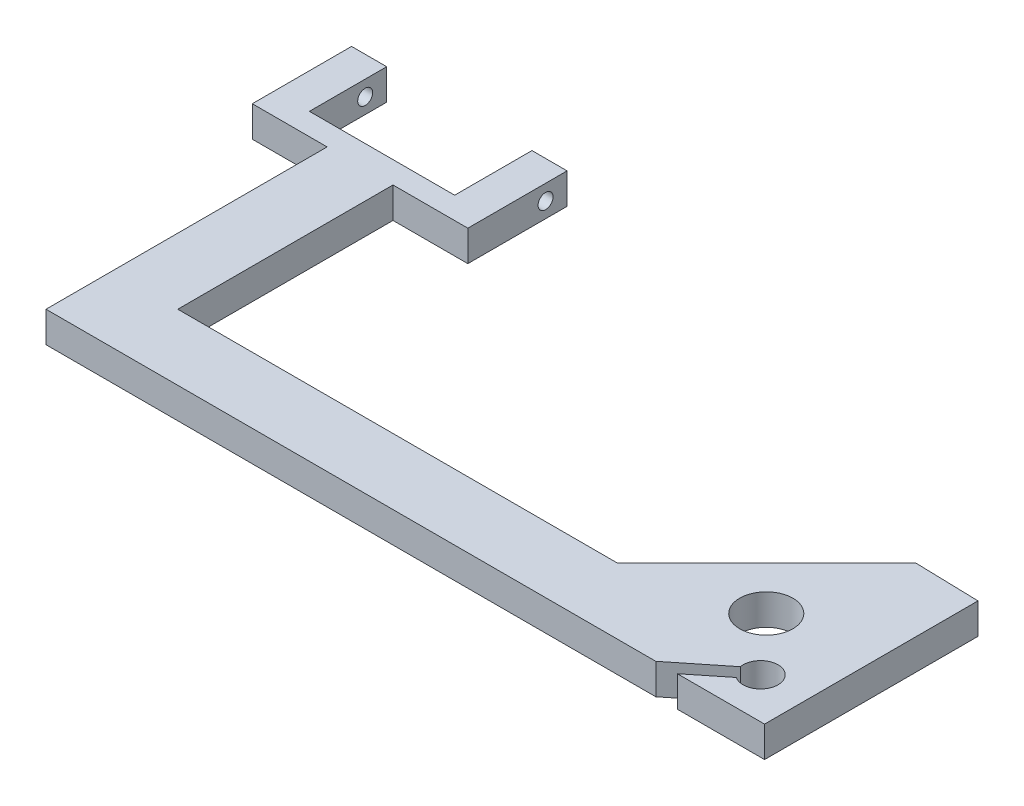
ISO-10303-21;
HEADER;
FILE_DESCRIPTION(('STEP AP214'),'2;1');
FILE_NAME('part.step','',(''),(''),'','','');
FILE_SCHEMA(('AUTOMOTIVE_DESIGN { 1 0 10303 214 1 1 1 1 }'));
ENDSEC;
DATA;
#1=APPLICATION_CONTEXT('core data for automotive mechanical design processes');
#2=APPLICATION_PROTOCOL_DEFINITION('international standard','automotive_design',2000,#1);
#3=PRODUCT_CONTEXT('',#1,'mechanical');
#4=PRODUCT('Part','Part','',(#3));
#5=PRODUCT_RELATED_PRODUCT_CATEGORY('part','',(#4));
#6=PRODUCT_DEFINITION_FORMATION('','',#4);
#7=PRODUCT_DEFINITION_CONTEXT('part definition',#1,'design');
#8=PRODUCT_DEFINITION('design','',#6,#7);
#9=PRODUCT_DEFINITION_SHAPE('','',#8);
#10=(LENGTH_UNIT() NAMED_UNIT(*) SI_UNIT(.MILLI.,.METRE.));
#11=(NAMED_UNIT(*) PLANE_ANGLE_UNIT() SI_UNIT($,.RADIAN.));
#12=(NAMED_UNIT(*) SI_UNIT($,.STERADIAN.) SOLID_ANGLE_UNIT());
#13=UNCERTAINTY_MEASURE_WITH_UNIT(LENGTH_MEASURE(1.E-05),#10,'distance_accuracy_value','');
#14=(GEOMETRIC_REPRESENTATION_CONTEXT(3) GLOBAL_UNCERTAINTY_ASSIGNED_CONTEXT((#13)) GLOBAL_UNIT_ASSIGNED_CONTEXT((#10,
#11,#12)) REPRESENTATION_CONTEXT('',''));
#15=CARTESIAN_POINT('',(0.,0.,0.));
#16=DIRECTION('',(0.,0.,1.));
#17=DIRECTION('',(1.,0.,0.));
#18=AXIS2_PLACEMENT_3D('',#15,#16,#17);
#19=CARTESIAN_POINT('',(76.0449505918015,7.,103.497483209416));
#20=DIRECTION('',(0.,1.,0.));
#21=DIRECTION('',(0.,0.,1.));
#22=AXIS2_PLACEMENT_3D('',#19,#20,#21);
#23=PLANE('',#22);
#24=DIRECTION('',(-1.,0.,0.));
#25=VECTOR('',#24,1.);
#26=CARTESIAN_POINT('',(-86.41,7.,26.1651780117579));
#27=LINE('',#26,#25);
#28=CARTESIAN_POINT('',(-86.41,7.,26.1651780117579));
#29=VERTEX_POINT('',#28);
#30=CARTESIAN_POINT('',(-94.41,7.,26.1651780117579));
#31=VERTEX_POINT('',#30);
#32=EDGE_CURVE('E247',#29,#31,#27,.T.);
#33=ORIENTED_EDGE('',*,*,#32,.T.);
#34=DIRECTION('',(0.,0.,1.));
#35=VECTOR('',#34,1.);
#36=CARTESIAN_POINT('',(-94.41,7.,26.1651780117579));
#37=LINE('',#36,#35);
#38=CARTESIAN_POINT('',(-94.41,7.,48.7651780117579));
#39=VERTEX_POINT('',#38);
#40=EDGE_CURVE('E134',#31,#39,#37,.T.);
#41=ORIENTED_EDGE('',*,*,#40,.T.);
#42=DIRECTION('',(1.,0.,0.));
#43=VECTOR('',#42,1.);
#44=CARTESIAN_POINT('',(-94.41,7.,48.7651780117579));
#45=LINE('',#44,#43);
#46=CARTESIAN_POINT('',(-77.375,7.,48.7651780117579));
#47=VERTEX_POINT('',#46);
#48=EDGE_CURVE('E299',#39,#47,#45,.T.);
#49=ORIENTED_EDGE('',*,*,#48,.T.);
#50=DIRECTION('',(0.,0.,1.));
#51=VECTOR('',#50,1.);
#52=CARTESIAN_POINT('',(-77.375,7.,48.7651780117579));
#53=LINE('',#52,#51);
#54=CARTESIAN_POINT('',(-77.375,7.,112.765178011758));
#55=VERTEX_POINT('',#54);
#56=EDGE_CURVE('E317',#47,#55,#53,.T.);
#57=ORIENTED_EDGE('',*,*,#56,.T.);
#58=DIRECTION('',(1.,0.,0.));
#59=VECTOR('',#58,1.);
#60=CARTESIAN_POINT('',(-77.375,7.,112.765178011758));
#61=LINE('',#60,#59);
#62=CARTESIAN_POINT('',(61.447619717696,7.,112.765178011758));
#63=VERTEX_POINT('',#62);
#64=EDGE_CURVE('E314',#55,#63,#61,.T.);
#65=ORIENTED_EDGE('',*,*,#64,.T.);
#66=DIRECTION('',(0.7806247497998,0.,-0.625));
#67=VECTOR('',#66,1.);
#68=CARTESIAN_POINT('',(72.140531110997,7.,104.203997210705));
#69=LINE('',#68,#67);
#70=CARTESIAN_POINT('',(72.140531110997,7.,104.203997210705));
#71=VERTEX_POINT('',#70);
#72=EDGE_CURVE('E316',#63,#71,#69,.T.);
#73=ORIENTED_EDGE('',*,*,#72,.T.);
#74=CARTESIAN_POINT('',(76.0449505918015,7.,103.497483209416));
#75=DIRECTION('',(0.,-1.,0.));
#76=DIRECTION('',(0.,0.,1.));
#77=AXIS2_PLACEMENT_3D('',#74,#75,#76);
#78=CIRCLE('',#77,3.96782730421856);
#79=CARTESIAN_POINT('',(73.8210632376066,7.,106.783510986529));
#80=VERTEX_POINT('',#79);
#81=EDGE_CURVE('E319',#71,#80,#78,.T.);
#82=ORIENTED_EDGE('',*,*,#81,.T.);
#83=DIRECTION('',(-0.780624749799801,0.,0.624999999999999));
#84=VECTOR('',#83,1.);
#85=CARTESIAN_POINT('',(66.3499635176781,7.,112.765178011758));
#86=LINE('',#85,#84);
#87=CARTESIAN_POINT('',(66.3499635176781,7.,112.765178011758));
#88=VERTEX_POINT('',#87);
#89=EDGE_CURVE('E325',#80,#88,#86,.T.);
#90=ORIENTED_EDGE('',*,*,#89,.T.);
#91=DIRECTION('',(1.,0.,0.));
#92=VECTOR('',#91,1.);
#93=CARTESIAN_POINT('',(66.3499635176781,7.,112.765178011758));
#94=LINE('',#93,#92);
#95=CARTESIAN_POINT('',(86.215,7.,112.765178011758));
#96=VERTEX_POINT('',#95);
#97=EDGE_CURVE('E327',#88,#96,#94,.T.);
#98=ORIENTED_EDGE('',*,*,#97,.T.);
#99=DIRECTION('',(0.,0.,-1.));
#100=VECTOR('',#99,1.);
#101=CARTESIAN_POINT('',(86.215,7.,112.765178011758));
#102=LINE('',#101,#100);
#103=CARTESIAN_POINT('',(86.215,7.,64.1751780117579));
#104=VERTEX_POINT('',#103);
#105=EDGE_CURVE('E329',#96,#104,#102,.T.);
#106=ORIENTED_EDGE('',*,*,#105,.T.);
#107=DIRECTION('',(-0.999653208963218,0.,-0.0263336630482963));
#108=VECTOR('',#107,1.);
#109=CARTESIAN_POINT('',(71.6000000000001,7.,63.7901780117579));
#110=LINE('',#109,#108);
#111=CARTESIAN_POINT('',(71.6000000000001,7.,63.7901780117579));
#112=VERTEX_POINT('',#111);
#113=EDGE_CURVE('E331',#104,#112,#110,.T.);
#114=ORIENTED_EDGE('',*,*,#113,.T.);
#115=DIRECTION('',(-0.707106781186548,0.,0.707106781186547));
#116=VECTOR('',#115,1.);
#117=CARTESIAN_POINT('',(71.6000000000001,7.,63.7901780117579));
#118=LINE('',#117,#116);
#119=CARTESIAN_POINT('',(37.625,7.,97.7651780117579));
#120=VERTEX_POINT('',#119);
#121=EDGE_CURVE('E333',#112,#120,#118,.T.);
#122=ORIENTED_EDGE('',*,*,#121,.T.);
#123=DIRECTION('',(-1.,0.,0.));
#124=VECTOR('',#123,1.);
#125=CARTESIAN_POINT('',(-62.375,7.,97.7651780117579));
#126=LINE('',#125,#124);
#127=CARTESIAN_POINT('',(-62.375,7.,97.7651780117579));
#128=VERTEX_POINT('',#127);
#129=EDGE_CURVE('E335',#120,#128,#126,.T.);
#130=ORIENTED_EDGE('',*,*,#129,.T.);
#131=DIRECTION('',(0.,0.,-1.));
#132=VECTOR('',#131,1.);
#133=CARTESIAN_POINT('',(-62.375,7.,48.7651780117579));
#134=LINE('',#133,#132);
#135=CARTESIAN_POINT('',(-62.375,7.,48.7651780117579));
#136=VERTEX_POINT('',#135);
#137=EDGE_CURVE('E337',#128,#136,#134,.T.);
#138=ORIENTED_EDGE('',*,*,#137,.T.);
#139=DIRECTION('',(1.,0.,0.));
#140=VECTOR('',#139,1.);
#141=CARTESIAN_POINT('',(-45.34,7.,48.7651780117579));
#142=LINE('',#141,#140);
#143=CARTESIAN_POINT('',(-45.34,7.,48.7651780117579));
#144=VERTEX_POINT('',#143);
#145=EDGE_CURVE('E339',#136,#144,#142,.T.);
#146=ORIENTED_EDGE('',*,*,#145,.T.);
#147=DIRECTION('',(0.,0.,-1.));
#148=VECTOR('',#147,1.);
#149=CARTESIAN_POINT('',(-45.34,7.,26.1651780117579));
#150=LINE('',#149,#148);
#151=CARTESIAN_POINT('',(-45.34,7.,26.1651780117579));
#152=VERTEX_POINT('',#151);
#153=EDGE_CURVE('E341',#144,#152,#150,.T.);
#154=ORIENTED_EDGE('',*,*,#153,.T.);
#155=DIRECTION('',(-1.,0.,0.));
#156=VECTOR('',#155,1.);
#157=CARTESIAN_POINT('',(-53.34,7.,26.1651780117579));
#158=LINE('',#157,#156);
#159=CARTESIAN_POINT('',(-53.34,7.,26.1651780117579));
#160=VERTEX_POINT('',#159);
#161=EDGE_CURVE('E189',#152,#160,#158,.T.);
#162=ORIENTED_EDGE('',*,*,#161,.T.);
#163=DIRECTION('',(0.,0.,1.));
#164=VECTOR('',#163,1.);
#165=CARTESIAN_POINT('',(-53.34,7.,43.7651780117579));
#166=LINE('',#165,#164);
#167=CARTESIAN_POINT('',(-53.34,7.,43.7651780117579));
#168=VERTEX_POINT('',#167);
#169=EDGE_CURVE('E183',#160,#168,#166,.T.);
#170=ORIENTED_EDGE('',*,*,#169,.T.);
#171=DIRECTION('',(-1.,0.,0.));
#172=VECTOR('',#171,1.);
#173=CARTESIAN_POINT('',(-86.41,7.,43.7651780117579));
#174=LINE('',#173,#172);
#175=CARTESIAN_POINT('',(-86.41,7.,43.7651780117579));
#176=VERTEX_POINT('',#175);
#177=EDGE_CURVE('E187',#168,#176,#174,.T.);
#178=ORIENTED_EDGE('',*,*,#177,.T.);
#179=DIRECTION('',(0.,0.,-1.));
#180=VECTOR('',#179,1.);
#181=CARTESIAN_POINT('',(-86.41,7.,26.1651780117579));
#182=LINE('',#181,#180);
#183=EDGE_CURVE('E55',#176,#29,#182,.T.);
#184=ORIENTED_EDGE('',*,*,#183,.T.);
#185=EDGE_LOOP('',(#33,#41,#49,#57,#65,#73,#82,#90,#98,#106,#114,#122,#130,#138,#146,#154,#162,
#170,#178,#184));
#186=FACE_BOUND('',#185,.T.);
#187=CARTESIAN_POINT('',(64.6000000000001,7.,90.7651780117579));
#188=DIRECTION('',(0.,1.,0.));
#189=DIRECTION('',(0.,0.,1.));
#190=AXIS2_PLACEMENT_3D('',#187,#188,#189);
#191=CIRCLE('',#190,6.05);
#192=CARTESIAN_POINT('',(64.6000000000001,7.,96.8151780117579));
#193=VERTEX_POINT('',#192);
#194=EDGE_CURVE('E211',#193,#193,#191,.T.);
#195=ORIENTED_EDGE('',*,*,#194,.F.);
#196=EDGE_LOOP('',(#195));
#197=FACE_BOUND('',#196,.T.);
#198=ADVANCED_FACE('F37',(#186,#197),#23,.T.);
#199=CARTESIAN_POINT('',(76.0449505918015,0.,103.497483209416));
#200=DIRECTION('',(0.,1.,0.));
#201=DIRECTION('',(0.,0.,1.));
#202=AXIS2_PLACEMENT_3D('',#199,#200,#201);
#203=PLANE('',#202);
#204=DIRECTION('',(-1.,0.,0.));
#205=VECTOR('',#204,1.);
#206=CARTESIAN_POINT('',(-86.41,0.,26.1651780117579));
#207=LINE('',#206,#205);
#208=CARTESIAN_POINT('',(-86.41,0.,26.1651780117579));
#209=VERTEX_POINT('',#208);
#210=CARTESIAN_POINT('',(-94.41,0.,26.1651780117579));
#211=VERTEX_POINT('',#210);
#212=EDGE_CURVE('E207',#209,#211,#207,.T.);
#213=ORIENTED_EDGE('',*,*,#212,.F.);
#214=DIRECTION('',(0.,0.,-1.));
#215=VECTOR('',#214,1.);
#216=CARTESIAN_POINT('',(-86.41,0.,26.1651780117579));
#217=LINE('',#216,#215);
#218=CARTESIAN_POINT('',(-86.41,0.,43.7651780117579));
#219=VERTEX_POINT('',#218);
#220=EDGE_CURVE('E126',#219,#209,#217,.T.);
#221=ORIENTED_EDGE('',*,*,#220,.F.);
#222=DIRECTION('',(-1.,0.,0.));
#223=VECTOR('',#222,1.);
#224=CARTESIAN_POINT('',(-86.41,0.,43.7651780117579));
#225=LINE('',#224,#223);
#226=CARTESIAN_POINT('',(-53.34,0.,43.7651780117579));
#227=VERTEX_POINT('',#226);
#228=EDGE_CURVE('E120',#227,#219,#225,.T.);
#229=ORIENTED_EDGE('',*,*,#228,.F.);
#230=DIRECTION('',(0.,0.,1.));
#231=VECTOR('',#230,1.);
#232=CARTESIAN_POINT('',(-53.34,0.,43.7651780117579));
#233=LINE('',#232,#231);
#234=CARTESIAN_POINT('',(-53.34,0.,26.1651780117579));
#235=VERTEX_POINT('',#234);
#236=EDGE_CURVE('E197',#235,#227,#233,.T.);
#237=ORIENTED_EDGE('',*,*,#236,.F.);
#238=DIRECTION('',(-1.,0.,0.));
#239=VECTOR('',#238,1.);
#240=CARTESIAN_POINT('',(-53.34,0.,26.1651780117579));
#241=LINE('',#240,#239);
#242=CARTESIAN_POINT('',(-45.34,0.,26.1651780117579));
#243=VERTEX_POINT('',#242);
#244=EDGE_CURVE('E242',#243,#235,#241,.T.);
#245=ORIENTED_EDGE('',*,*,#244,.F.);
#246=DIRECTION('',(0.,0.,-1.));
#247=VECTOR('',#246,1.);
#248=CARTESIAN_POINT('',(-45.34,0.,26.1651780117579));
#249=LINE('',#248,#247);
#250=CARTESIAN_POINT('',(-45.34,0.,48.7651780117579));
#251=VERTEX_POINT('',#250);
#252=EDGE_CURVE('E240',#251,#243,#249,.T.);
#253=ORIENTED_EDGE('',*,*,#252,.F.);
#254=DIRECTION('',(1.,0.,0.));
#255=VECTOR('',#254,1.);
#256=CARTESIAN_POINT('',(-45.34,0.,48.7651780117579));
#257=LINE('',#256,#255);
#258=CARTESIAN_POINT('',(-62.375,0.,48.7651780117579));
#259=VERTEX_POINT('',#258);
#260=EDGE_CURVE('E238',#259,#251,#257,.T.);
#261=ORIENTED_EDGE('',*,*,#260,.F.);
#262=DIRECTION('',(0.,0.,-1.));
#263=VECTOR('',#262,1.);
#264=CARTESIAN_POINT('',(-62.375,0.,48.7651780117579));
#265=LINE('',#264,#263);
#266=CARTESIAN_POINT('',(-62.375,0.,97.7651780117579));
#267=VERTEX_POINT('',#266);
#268=EDGE_CURVE('E236',#267,#259,#265,.T.);
#269=ORIENTED_EDGE('',*,*,#268,.F.);
#270=DIRECTION('',(-1.,0.,0.));
#271=VECTOR('',#270,1.);
#272=CARTESIAN_POINT('',(-62.375,0.,97.7651780117579));
#273=LINE('',#272,#271);
#274=CARTESIAN_POINT('',(37.625,0.,97.7651780117579));
#275=VERTEX_POINT('',#274);
#276=EDGE_CURVE('E234',#275,#267,#273,.T.);
#277=ORIENTED_EDGE('',*,*,#276,.F.);
#278=DIRECTION('',(-0.707106781186548,0.,0.707106781186547));
#279=VECTOR('',#278,1.);
#280=CARTESIAN_POINT('',(71.6000000000001,0.,63.7901780117579));
#281=LINE('',#280,#279);
#282=CARTESIAN_POINT('',(71.6000000000001,0.,63.7901780117579));
#283=VERTEX_POINT('',#282);
#284=EDGE_CURVE('E232',#283,#275,#281,.T.);
#285=ORIENTED_EDGE('',*,*,#284,.F.);
#286=DIRECTION('',(-0.999653208963218,0.,-0.0263336630482963));
#287=VECTOR('',#286,1.);
#288=CARTESIAN_POINT('',(71.6000000000001,0.,63.7901780117579));
#289=LINE('',#288,#287);
#290=CARTESIAN_POINT('',(86.215,0.,64.1751780117579));
#291=VERTEX_POINT('',#290);
#292=EDGE_CURVE('E230',#291,#283,#289,.T.);
#293=ORIENTED_EDGE('',*,*,#292,.F.);
#294=DIRECTION('',(0.,0.,-1.));
#295=VECTOR('',#294,1.);
#296=CARTESIAN_POINT('',(86.215,0.,112.765178011758));
#297=LINE('',#296,#295);
#298=CARTESIAN_POINT('',(86.215,0.,112.765178011758));
#299=VERTEX_POINT('',#298);
#300=EDGE_CURVE('E228',#299,#291,#297,.T.);
#301=ORIENTED_EDGE('',*,*,#300,.F.);
#302=DIRECTION('',(1.,0.,0.));
#303=VECTOR('',#302,1.);
#304=CARTESIAN_POINT('',(66.3499635176781,0.,112.765178011758));
#305=LINE('',#304,#303);
#306=CARTESIAN_POINT('',(66.3499635176781,0.,112.765178011758));
#307=VERTEX_POINT('',#306);
#308=EDGE_CURVE('E226',#307,#299,#305,.T.);
#309=ORIENTED_EDGE('',*,*,#308,.F.);
#310=DIRECTION('',(-0.780624749799801,0.,0.624999999999999));
#311=VECTOR('',#310,1.);
#312=CARTESIAN_POINT('',(66.3499635176781,0.,112.765178011758));
#313=LINE('',#312,#311);
#314=CARTESIAN_POINT('',(73.8210632376066,0.,106.783510986529));
#315=VERTEX_POINT('',#314);
#316=EDGE_CURVE('E224',#315,#307,#313,.T.);
#317=ORIENTED_EDGE('',*,*,#316,.F.);
#318=CARTESIAN_POINT('',(76.0449505918015,0.,103.497483209416));
#319=DIRECTION('',(0.,-1.,0.));
#320=DIRECTION('',(0.,0.,1.));
#321=AXIS2_PLACEMENT_3D('',#318,#319,#320);
#322=CIRCLE('',#321,3.96782730421856);
#323=CARTESIAN_POINT('',(72.140531110997,0.,104.203997210705));
#324=VERTEX_POINT('',#323);
#325=EDGE_CURVE('E222',#324,#315,#322,.T.);
#326=ORIENTED_EDGE('',*,*,#325,.F.);
#327=DIRECTION('',(0.7806247497998,0.,-0.625));
#328=VECTOR('',#327,1.);
#329=CARTESIAN_POINT('',(72.140531110997,0.,104.203997210705));
#330=LINE('',#329,#328);
#331=CARTESIAN_POINT('',(61.447619717696,0.,112.765178011758));
#332=VERTEX_POINT('',#331);
#333=EDGE_CURVE('E220',#332,#324,#330,.T.);
#334=ORIENTED_EDGE('',*,*,#333,.F.);
#335=DIRECTION('',(1.,0.,0.));
#336=VECTOR('',#335,1.);
#337=CARTESIAN_POINT('',(61.447619717696,0.,112.765178011758));
#338=LINE('',#337,#336);
#339=CARTESIAN_POINT('',(-77.375,0.,112.765178011758));
#340=VERTEX_POINT('',#339);
#341=EDGE_CURVE('E218',#340,#332,#338,.T.);
#342=ORIENTED_EDGE('',*,*,#341,.F.);
#343=DIRECTION('',(0.,0.,1.));
#344=VECTOR('',#343,1.);
#345=CARTESIAN_POINT('',(-77.375,0.,48.7651780117579));
#346=LINE('',#345,#344);
#347=CARTESIAN_POINT('',(-77.375,0.,48.7651780117579));
#348=VERTEX_POINT('',#347);
#349=EDGE_CURVE('E215',#348,#340,#346,.T.);
#350=ORIENTED_EDGE('',*,*,#349,.F.);
#351=DIRECTION('',(1.,0.,0.));
#352=VECTOR('',#351,1.);
#353=CARTESIAN_POINT('',(-94.41,0.,48.7651780117579));
#354=LINE('',#353,#352);
#355=CARTESIAN_POINT('',(-94.41,0.,48.7651780117579));
#356=VERTEX_POINT('',#355);
#357=EDGE_CURVE('E213',#356,#348,#354,.T.);
#358=ORIENTED_EDGE('',*,*,#357,.F.);
#359=DIRECTION('',(0.,0.,1.));
#360=VECTOR('',#359,1.);
#361=CARTESIAN_POINT('',(-94.41,0.,26.1651780117579));
#362=LINE('',#361,#360);
#363=EDGE_CURVE('E210',#211,#356,#362,.T.);
#364=ORIENTED_EDGE('',*,*,#363,.F.);
#365=EDGE_LOOP('',(#213,#221,#229,#237,#245,#253,#261,#269,#277,#285,#293,#301,#309,#317,#326,
#334,#342,#350,#358,#364));
#366=FACE_BOUND('',#365,.T.);
#367=CARTESIAN_POINT('',(64.6000000000001,0.,90.7651780117579));
#368=DIRECTION('',(0.,1.,0.));
#369=DIRECTION('',(0.,0.,1.));
#370=AXIS2_PLACEMENT_3D('',#367,#368,#369);
#371=CIRCLE('',#370,6.05);
#372=CARTESIAN_POINT('',(64.6000000000001,0.,96.8151780117579));
#373=VERTEX_POINT('',#372);
#374=EDGE_CURVE('E389',#373,#373,#371,.T.);
#375=ORIENTED_EDGE('',*,*,#374,.T.);
#376=EDGE_LOOP('',(#375));
#377=FACE_BOUND('',#376,.T.);
#378=ADVANCED_FACE('F303',(#366,#377),#203,.F.);
#379=CARTESIAN_POINT('',(-86.41,7.,26.1651780117579));
#380=DIRECTION('',(0.,0.,1.));
#381=DIRECTION('',(1.,0.,0.));
#382=AXIS2_PLACEMENT_3D('',#379,#380,#381);
#383=PLANE('',#382);
#384=ORIENTED_EDGE('',*,*,#212,.T.);
#385=DIRECTION('',(0.,-1.,0.));
#386=VECTOR('',#385,1.);
#387=CARTESIAN_POINT('',(-94.41,7.,26.1651780117579));
#388=LINE('',#387,#386);
#389=EDGE_CURVE('E11',#31,#211,#388,.T.);
#390=ORIENTED_EDGE('',*,*,#389,.F.);
#391=ORIENTED_EDGE('',*,*,#32,.F.);
#392=DIRECTION('',(0.,-1.,0.));
#393=VECTOR('',#392,1.);
#394=CARTESIAN_POINT('',(-86.41,7.,26.1651780117579));
#395=LINE('',#394,#393);
#396=EDGE_CURVE('E203',#29,#209,#395,.T.);
#397=ORIENTED_EDGE('',*,*,#396,.T.);
#398=EDGE_LOOP('',(#384,#390,#391,#397));
#399=FACE_BOUND('',#398,.T.);
#400=ADVANCED_FACE('F39',(#399),#383,.F.);
#401=CARTESIAN_POINT('',(-94.41,7.,26.1651780117579));
#402=DIRECTION('',(1.,0.,0.));
#403=DIRECTION('',(0.,0.,-1.));
#404=AXIS2_PLACEMENT_3D('',#401,#402,#403);
#405=PLANE('',#404);
#406=CARTESIAN_POINT('',(-94.41,3.5,31.0651780117579));
#407=DIRECTION('',(1.,0.,0.));
#408=DIRECTION('',(0.,0.,-1.));
#409=AXIS2_PLACEMENT_3D('',#406,#407,#408);
#410=CIRCLE('',#409,1.7);
#411=CARTESIAN_POINT('',(-94.41,3.5,29.3651780117579));
#412=VERTEX_POINT('',#411);
#413=EDGE_CURVE('E387',#412,#412,#410,.T.);
#414=ORIENTED_EDGE('',*,*,#413,.T.);
#415=EDGE_LOOP('',(#414));
#416=FACE_BOUND('',#415,.T.);
#417=ORIENTED_EDGE('',*,*,#363,.T.);
#418=DIRECTION('',(0.,-1.,0.));
#419=VECTOR('',#418,1.);
#420=CARTESIAN_POINT('',(-94.41,7.,48.7651780117579));
#421=LINE('',#420,#419);
#422=EDGE_CURVE('E47',#39,#356,#421,.T.);
#423=ORIENTED_EDGE('',*,*,#422,.F.);
#424=ORIENTED_EDGE('',*,*,#40,.F.);
#425=ORIENTED_EDGE('',*,*,#389,.T.);
#426=EDGE_LOOP('',(#417,#423,#424,#425));
#427=FACE_BOUND('',#426,.T.);
#428=ADVANCED_FACE('F462',(#416,#427),#405,.F.);
#429=CARTESIAN_POINT('',(-94.41,7.,48.7651780117579));
#430=DIRECTION('',(0.,0.,-1.));
#431=DIRECTION('',(-1.,0.,0.));
#432=AXIS2_PLACEMENT_3D('',#429,#430,#431);
#433=PLANE('',#432);
#434=ORIENTED_EDGE('',*,*,#357,.T.);
#435=DIRECTION('',(0.,-1.,0.));
#436=VECTOR('',#435,1.);
#437=CARTESIAN_POINT('',(-77.375,7.,48.7651780117579));
#438=LINE('',#437,#436);
#439=EDGE_CURVE('E290',#47,#348,#438,.T.);
#440=ORIENTED_EDGE('',*,*,#439,.F.);
#441=ORIENTED_EDGE('',*,*,#48,.F.);
#442=ORIENTED_EDGE('',*,*,#422,.T.);
#443=EDGE_LOOP('',(#434,#440,#441,#442));
#444=FACE_BOUND('',#443,.T.);
#445=ADVANCED_FACE('F297',(#444),#433,.F.);
#446=CARTESIAN_POINT('',(-77.375,7.,48.7651780117579));
#447=DIRECTION('',(1.,0.,0.));
#448=DIRECTION('',(0.,0.,-1.));
#449=AXIS2_PLACEMENT_3D('',#446,#447,#448);
#450=PLANE('',#449);
#451=ORIENTED_EDGE('',*,*,#349,.T.);
#452=DIRECTION('',(0.,-1.,0.));
#453=VECTOR('',#452,1.);
#454=CARTESIAN_POINT('',(-77.375,7.,112.765178011758));
#455=LINE('',#454,#453);
#456=EDGE_CURVE('E287',#55,#340,#455,.T.);
#457=ORIENTED_EDGE('',*,*,#456,.F.);
#458=ORIENTED_EDGE('',*,*,#56,.F.);
#459=ORIENTED_EDGE('',*,*,#439,.T.);
#460=EDGE_LOOP('',(#451,#457,#458,#459));
#461=FACE_BOUND('',#460,.T.);
#462=ADVANCED_FACE('F308',(#461),#450,.F.);
#463=CARTESIAN_POINT('',(61.447619717696,7.,112.765178011758));
#464=DIRECTION('',(0.,0.,-1.));
#465=DIRECTION('',(-1.,0.,0.));
#466=AXIS2_PLACEMENT_3D('',#463,#464,#465);
#467=PLANE('',#466);
#468=ORIENTED_EDGE('',*,*,#341,.T.);
#469=DIRECTION('',(0.,-1.,0.));
#470=VECTOR('',#469,1.);
#471=CARTESIAN_POINT('',(61.447619717696,7.,112.765178011758));
#472=LINE('',#471,#470);
#473=EDGE_CURVE('E284',#63,#332,#472,.T.);
#474=ORIENTED_EDGE('',*,*,#473,.F.);
#475=ORIENTED_EDGE('',*,*,#64,.F.);
#476=ORIENTED_EDGE('',*,*,#456,.T.);
#477=EDGE_LOOP('',(#468,#474,#475,#476));
#478=FACE_BOUND('',#477,.T.);
#479=ADVANCED_FACE('F312',(#478),#467,.F.);
#480=CARTESIAN_POINT('',(72.140531110997,7.,104.203997210705));
#481=DIRECTION('',(-0.625,0.,-0.7806247497998));
#482=DIRECTION('',(-0.7806247497998,0.,0.625));
#483=AXIS2_PLACEMENT_3D('',#480,#481,#482);
#484=PLANE('',#483);
#485=ORIENTED_EDGE('',*,*,#333,.T.);
#486=DIRECTION('',(0.,-1.,0.));
#487=VECTOR('',#486,1.);
#488=CARTESIAN_POINT('',(72.140531110997,7.,104.203997210705));
#489=LINE('',#488,#487);
#490=EDGE_CURVE('E281',#71,#324,#489,.T.);
#491=ORIENTED_EDGE('',*,*,#490,.F.);
#492=ORIENTED_EDGE('',*,*,#72,.F.);
#493=ORIENTED_EDGE('',*,*,#473,.T.);
#494=EDGE_LOOP('',(#485,#491,#492,#493));
#495=FACE_BOUND('',#494,.T.);
#496=ADVANCED_FACE('F452',(#495),#484,.F.);
#497=CARTESIAN_POINT('',(76.0449505918015,7.,103.497483209416));
#498=DIRECTION('',(0.,-1.,0.));
#499=DIRECTION('',(0.,0.,-1.));
#500=AXIS2_PLACEMENT_3D('',#497,#498,#499);
#501=CYLINDRICAL_SURFACE('',#500,3.96782730421856);
#502=ORIENTED_EDGE('',*,*,#325,.T.);
#503=DIRECTION('',(0.,-1.,0.));
#504=VECTOR('',#503,1.);
#505=CARTESIAN_POINT('',(73.8210632376066,7.,106.783510986529));
#506=LINE('',#505,#504);
#507=EDGE_CURVE('E278',#80,#315,#506,.T.);
#508=ORIENTED_EDGE('',*,*,#507,.F.);
#509=ORIENTED_EDGE('',*,*,#81,.F.);
#510=ORIENTED_EDGE('',*,*,#490,.T.);
#511=EDGE_LOOP('',(#502,#508,#509,#510));
#512=FACE_BOUND('',#511,.T.);
#513=ADVANCED_FACE('F448',(#512),#501,.F.);
#514=CARTESIAN_POINT('',(66.3499635176781,7.,112.765178011758));
#515=DIRECTION('',(0.624999999999999,0.,0.780624749799801));
#516=DIRECTION('',(0.780624749799801,0.,-0.624999999999999));
#517=AXIS2_PLACEMENT_3D('',#514,#515,#516);
#518=PLANE('',#517);
#519=ORIENTED_EDGE('',*,*,#316,.T.);
#520=DIRECTION('',(0.,-1.,0.));
#521=VECTOR('',#520,1.);
#522=CARTESIAN_POINT('',(66.3499635176781,7.,112.765178011758));
#523=LINE('',#522,#521);
#524=EDGE_CURVE('E275',#88,#307,#523,.T.);
#525=ORIENTED_EDGE('',*,*,#524,.F.);
#526=ORIENTED_EDGE('',*,*,#89,.F.);
#527=ORIENTED_EDGE('',*,*,#507,.T.);
#528=EDGE_LOOP('',(#519,#525,#526,#527));
#529=FACE_BOUND('',#528,.T.);
#530=ADVANCED_FACE('F444',(#529),#518,.F.);
#531=CARTESIAN_POINT('',(66.3499635176781,7.,112.765178011758));
#532=DIRECTION('',(0.,0.,-1.));
#533=DIRECTION('',(-1.,0.,0.));
#534=AXIS2_PLACEMENT_3D('',#531,#532,#533);
#535=PLANE('',#534);
#536=ORIENTED_EDGE('',*,*,#308,.T.);
#537=DIRECTION('',(0.,-1.,0.));
#538=VECTOR('',#537,1.);
#539=CARTESIAN_POINT('',(86.215,7.,112.765178011758));
#540=LINE('',#539,#538);
#541=EDGE_CURVE('E272',#96,#299,#540,.T.);
#542=ORIENTED_EDGE('',*,*,#541,.F.);
#543=ORIENTED_EDGE('',*,*,#97,.F.);
#544=ORIENTED_EDGE('',*,*,#524,.T.);
#545=EDGE_LOOP('',(#536,#542,#543,#544));
#546=FACE_BOUND('',#545,.T.);
#547=ADVANCED_FACE('F440',(#546),#535,.F.);
#548=CARTESIAN_POINT('',(86.215,7.,112.765178011758));
#549=DIRECTION('',(-1.,0.,0.));
#550=DIRECTION('',(0.,0.,1.));
#551=AXIS2_PLACEMENT_3D('',#548,#549,#550);
#552=PLANE('',#551);
#553=ORIENTED_EDGE('',*,*,#300,.T.);
#554=DIRECTION('',(0.,-1.,0.));
#555=VECTOR('',#554,1.);
#556=CARTESIAN_POINT('',(86.215,7.,64.1751780117579));
#557=LINE('',#556,#555);
#558=EDGE_CURVE('E269',#104,#291,#557,.T.);
#559=ORIENTED_EDGE('',*,*,#558,.F.);
#560=ORIENTED_EDGE('',*,*,#105,.F.);
#561=ORIENTED_EDGE('',*,*,#541,.T.);
#562=EDGE_LOOP('',(#553,#559,#560,#561));
#563=FACE_BOUND('',#562,.T.);
#564=ADVANCED_FACE('F436',(#563),#552,.F.);
#565=CARTESIAN_POINT('',(71.6000000000001,7.,63.7901780117579));
#566=DIRECTION('',(-0.0263336630482963,0.,0.999653208963218));
#567=DIRECTION('',(0.999653208963218,0.,0.0263336630482963));
#568=AXIS2_PLACEMENT_3D('',#565,#566,#567);
#569=PLANE('',#568);
#570=ORIENTED_EDGE('',*,*,#292,.T.);
#571=DIRECTION('',(0.,-1.,0.));
#572=VECTOR('',#571,1.);
#573=CARTESIAN_POINT('',(71.6000000000001,7.,63.7901780117579));
#574=LINE('',#573,#572);
#575=EDGE_CURVE('E266',#112,#283,#574,.T.);
#576=ORIENTED_EDGE('',*,*,#575,.F.);
#577=ORIENTED_EDGE('',*,*,#113,.F.);
#578=ORIENTED_EDGE('',*,*,#558,.T.);
#579=EDGE_LOOP('',(#570,#576,#577,#578));
#580=FACE_BOUND('',#579,.T.);
#581=ADVANCED_FACE('F432',(#580),#569,.F.);
#582=CARTESIAN_POINT('',(71.6000000000001,7.,63.7901780117579));
#583=DIRECTION('',(0.707106781186547,0.,0.707106781186548));
#584=DIRECTION('',(0.707106781186548,0.,-0.707106781186547));
#585=AXIS2_PLACEMENT_3D('',#582,#583,#584);
#586=PLANE('',#585);
#587=ORIENTED_EDGE('',*,*,#284,.T.);
#588=DIRECTION('',(0.,-1.,0.));
#589=VECTOR('',#588,1.);
#590=CARTESIAN_POINT('',(37.625,7.,97.7651780117579));
#591=LINE('',#590,#589);
#592=EDGE_CURVE('E263',#120,#275,#591,.T.);
#593=ORIENTED_EDGE('',*,*,#592,.F.);
#594=ORIENTED_EDGE('',*,*,#121,.F.);
#595=ORIENTED_EDGE('',*,*,#575,.T.);
#596=EDGE_LOOP('',(#587,#593,#594,#595));
#597=FACE_BOUND('',#596,.T.);
#598=ADVANCED_FACE('F428',(#597),#586,.F.);
#599=CARTESIAN_POINT('',(-62.375,7.,97.7651780117579));
#600=DIRECTION('',(0.,0.,1.));
#601=DIRECTION('',(1.,0.,0.));
#602=AXIS2_PLACEMENT_3D('',#599,#600,#601);
#603=PLANE('',#602);
#604=ORIENTED_EDGE('',*,*,#276,.T.);
#605=DIRECTION('',(0.,-1.,0.));
#606=VECTOR('',#605,1.);
#607=CARTESIAN_POINT('',(-62.375,7.,97.7651780117579));
#608=LINE('',#607,#606);
#609=EDGE_CURVE('E260',#128,#267,#608,.T.);
#610=ORIENTED_EDGE('',*,*,#609,.F.);
#611=ORIENTED_EDGE('',*,*,#129,.F.);
#612=ORIENTED_EDGE('',*,*,#592,.T.);
#613=EDGE_LOOP('',(#604,#610,#611,#612));
#614=FACE_BOUND('',#613,.T.);
#615=ADVANCED_FACE('F424',(#614),#603,.F.);
#616=CARTESIAN_POINT('',(-62.375,7.,48.7651780117579));
#617=DIRECTION('',(-1.,0.,0.));
#618=DIRECTION('',(0.,0.,1.));
#619=AXIS2_PLACEMENT_3D('',#616,#617,#618);
#620=PLANE('',#619);
#621=ORIENTED_EDGE('',*,*,#268,.T.);
#622=DIRECTION('',(0.,-1.,0.));
#623=VECTOR('',#622,1.);
#624=CARTESIAN_POINT('',(-62.375,7.,48.7651780117579));
#625=LINE('',#624,#623);
#626=EDGE_CURVE('E257',#136,#259,#625,.T.);
#627=ORIENTED_EDGE('',*,*,#626,.F.);
#628=ORIENTED_EDGE('',*,*,#137,.F.);
#629=ORIENTED_EDGE('',*,*,#609,.T.);
#630=EDGE_LOOP('',(#621,#627,#628,#629));
#631=FACE_BOUND('',#630,.T.);
#632=ADVANCED_FACE('F417',(#631),#620,.F.);
#633=CARTESIAN_POINT('',(-45.34,7.,48.7651780117579));
#634=DIRECTION('',(0.,0.,-1.));
#635=DIRECTION('',(-1.,0.,0.));
#636=AXIS2_PLACEMENT_3D('',#633,#634,#635);
#637=PLANE('',#636);
#638=ORIENTED_EDGE('',*,*,#260,.T.);
#639=DIRECTION('',(0.,-1.,0.));
#640=VECTOR('',#639,1.);
#641=CARTESIAN_POINT('',(-45.34,7.,48.7651780117579));
#642=LINE('',#641,#640);
#643=EDGE_CURVE('E254',#144,#251,#642,.T.);
#644=ORIENTED_EDGE('',*,*,#643,.F.);
#645=ORIENTED_EDGE('',*,*,#145,.F.);
#646=ORIENTED_EDGE('',*,*,#626,.T.);
#647=EDGE_LOOP('',(#638,#644,#645,#646));
#648=FACE_BOUND('',#647,.T.);
#649=ADVANCED_FACE('F410',(#648),#637,.F.);
#650=CARTESIAN_POINT('',(-45.34,7.,26.1651780117579));
#651=DIRECTION('',(-1.,0.,0.));
#652=DIRECTION('',(0.,0.,1.));
#653=AXIS2_PLACEMENT_3D('',#650,#651,#652);
#654=PLANE('',#653);
#655=CARTESIAN_POINT('',(-45.34,3.5,31.0651780117579));
#656=DIRECTION('',(1.,0.,0.));
#657=DIRECTION('',(0.,0.,-1.));
#658=AXIS2_PLACEMENT_3D('',#655,#656,#657);
#659=CIRCLE('',#658,1.7);
#660=CARTESIAN_POINT('',(-45.34,3.5,29.3651780117579));
#661=VERTEX_POINT('',#660);
#662=EDGE_CURVE('E404',#661,#661,#659,.T.);
#663=ORIENTED_EDGE('',*,*,#662,.F.);
#664=EDGE_LOOP('',(#663));
#665=FACE_BOUND('',#664,.T.);
#666=ORIENTED_EDGE('',*,*,#252,.T.);
#667=DIRECTION('',(0.,-1.,0.));
#668=VECTOR('',#667,1.);
#669=CARTESIAN_POINT('',(-45.34,7.,26.1651780117579));
#670=LINE('',#669,#668);
#671=EDGE_CURVE('E251',#152,#243,#670,.T.);
#672=ORIENTED_EDGE('',*,*,#671,.F.);
#673=ORIENTED_EDGE('',*,*,#153,.F.);
#674=ORIENTED_EDGE('',*,*,#643,.T.);
#675=EDGE_LOOP('',(#666,#672,#673,#674));
#676=FACE_BOUND('',#675,.T.);
#677=ADVANCED_FACE('F347',(#665,#676),#654,.F.);
#678=CARTESIAN_POINT('',(-53.34,7.,26.1651780117579));
#679=DIRECTION('',(0.,0.,1.));
#680=DIRECTION('',(1.,0.,0.));
#681=AXIS2_PLACEMENT_3D('',#678,#679,#680);
#682=PLANE('',#681);
#683=ORIENTED_EDGE('',*,*,#244,.T.);
#684=DIRECTION('',(0.,-1.,0.));
#685=VECTOR('',#684,1.);
#686=CARTESIAN_POINT('',(-53.34,7.,26.1651780117579));
#687=LINE('',#686,#685);
#688=EDGE_CURVE('E198',#160,#235,#687,.T.);
#689=ORIENTED_EDGE('',*,*,#688,.F.);
#690=ORIENTED_EDGE('',*,*,#161,.F.);
#691=ORIENTED_EDGE('',*,*,#671,.T.);
#692=EDGE_LOOP('',(#683,#689,#690,#691));
#693=FACE_BOUND('',#692,.T.);
#694=ADVANCED_FACE('F351',(#693),#682,.F.);
#695=CARTESIAN_POINT('',(-53.34,7.,43.7651780117579));
#696=DIRECTION('',(1.,0.,0.));
#697=DIRECTION('',(0.,0.,-1.));
#698=AXIS2_PLACEMENT_3D('',#695,#696,#697);
#699=PLANE('',#698);
#700=CARTESIAN_POINT('',(-53.34,3.5,31.0651780117579));
#701=DIRECTION('',(1.,0.,0.));
#702=DIRECTION('',(0.,0.,-1.));
#703=AXIS2_PLACEMENT_3D('',#700,#701,#702);
#704=CIRCLE('',#703,1.7);
#705=CARTESIAN_POINT('',(-53.34,3.5,29.3651780117579));
#706=VERTEX_POINT('',#705);
#707=EDGE_CURVE('E390',#706,#706,#704,.T.);
#708=ORIENTED_EDGE('',*,*,#707,.T.);
#709=EDGE_LOOP('',(#708));
#710=FACE_BOUND('',#709,.T.);
#711=ORIENTED_EDGE('',*,*,#236,.T.);
#712=DIRECTION('',(0.,-1.,0.));
#713=VECTOR('',#712,1.);
#714=CARTESIAN_POINT('',(-53.34,7.,43.7651780117579));
#715=LINE('',#714,#713);
#716=EDGE_CURVE('E194',#168,#227,#715,.T.);
#717=ORIENTED_EDGE('',*,*,#716,.F.);
#718=ORIENTED_EDGE('',*,*,#169,.F.);
#719=ORIENTED_EDGE('',*,*,#688,.T.);
#720=EDGE_LOOP('',(#711,#717,#718,#719));
#721=FACE_BOUND('',#720,.T.);
#722=ADVANCED_FACE('F195',(#710,#721),#699,.F.);
#723=CARTESIAN_POINT('',(-86.41,7.,43.7651780117579));
#724=DIRECTION('',(0.,0.,1.));
#725=DIRECTION('',(1.,0.,0.));
#726=AXIS2_PLACEMENT_3D('',#723,#724,#725);
#727=PLANE('',#726);
#728=ORIENTED_EDGE('',*,*,#228,.T.);
#729=DIRECTION('',(0.,-1.,0.));
#730=VECTOR('',#729,1.);
#731=CARTESIAN_POINT('',(-86.41,7.,43.7651780117579));
#732=LINE('',#731,#730);
#733=EDGE_CURVE('E199',#176,#219,#732,.T.);
#734=ORIENTED_EDGE('',*,*,#733,.F.);
#735=ORIENTED_EDGE('',*,*,#177,.F.);
#736=ORIENTED_EDGE('',*,*,#716,.T.);
#737=EDGE_LOOP('',(#728,#734,#735,#736));
#738=FACE_BOUND('',#737,.T.);
#739=ADVANCED_FACE('F201',(#738),#727,.F.);
#740=CARTESIAN_POINT('',(-86.41,7.,26.1651780117579));
#741=DIRECTION('',(-1.,0.,0.));
#742=DIRECTION('',(0.,0.,1.));
#743=AXIS2_PLACEMENT_3D('',#740,#741,#742);
#744=PLANE('',#743);
#745=CARTESIAN_POINT('',(-86.41,3.5,31.0651780117579));
#746=DIRECTION('',(-1.,0.,0.));
#747=DIRECTION('',(0.,0.,1.));
#748=AXIS2_PLACEMENT_3D('',#745,#746,#747);
#749=CIRCLE('',#748,1.7);
#750=CARTESIAN_POINT('',(-86.41,3.5,32.7651780117579));
#751=VERTEX_POINT('',#750);
#752=EDGE_CURVE('E41',#751,#751,#749,.T.);
#753=ORIENTED_EDGE('',*,*,#752,.T.);
#754=EDGE_LOOP('',(#753));
#755=FACE_BOUND('',#754,.T.);
#756=ORIENTED_EDGE('',*,*,#220,.T.);
#757=ORIENTED_EDGE('',*,*,#396,.F.);
#758=ORIENTED_EDGE('',*,*,#183,.F.);
#759=ORIENTED_EDGE('',*,*,#733,.T.);
#760=EDGE_LOOP('',(#756,#757,#758,#759));
#761=FACE_BOUND('',#760,.T.);
#762=ADVANCED_FACE('F355',(#755,#761),#744,.F.);
#763=CARTESIAN_POINT('',(64.6000000000001,7.,90.7651780117579));
#764=DIRECTION('',(0.,-1.,0.));
#765=DIRECTION('',(0.,0.,-1.));
#766=AXIS2_PLACEMENT_3D('',#763,#764,#765);
#767=CYLINDRICAL_SURFACE('',#766,6.05);
#768=ORIENTED_EDGE('',*,*,#194,.T.);
#769=EDGE_LOOP('',(#768));
#770=FACE_BOUND('',#769,.T.);
#771=ORIENTED_EDGE('',*,*,#374,.F.);
#772=EDGE_LOOP('',(#771));
#773=FACE_BOUND('',#772,.T.);
#774=ADVANCED_FACE('F357',(#770,#773),#767,.F.);
#775=CARTESIAN_POINT('',(-105.34,3.5,31.0651780117579));
#776=DIRECTION('',(1.,0.,0.));
#777=DIRECTION('',(0.,0.,-1.));
#778=AXIS2_PLACEMENT_3D('',#775,#776,#777);
#779=CYLINDRICAL_SURFACE('',#778,1.7);
#780=ORIENTED_EDGE('',*,*,#752,.F.);
#781=EDGE_LOOP('',(#780));
#782=FACE_BOUND('',#781,.T.);
#783=ORIENTED_EDGE('',*,*,#413,.F.);
#784=EDGE_LOOP('',(#783));
#785=FACE_BOUND('',#784,.T.);
#786=ADVANCED_FACE('F364',(#782,#785),#779,.F.);
#787=ORIENTED_EDGE('',*,*,#662,.T.);
#788=EDGE_LOOP('',(#787));
#789=FACE_BOUND('',#788,.T.);
#790=ORIENTED_EDGE('',*,*,#707,.F.);
#791=EDGE_LOOP('',(#790));
#792=FACE_BOUND('',#791,.T.);
#793=ADVANCED_FACE('F377',(#789,#792),#779,.F.);
#794=CLOSED_SHELL('',(#198,#378,#400,#428,#445,#462,#479,#496,#513,#530,#547,#564,#581,#598,
#615,#632,#649,#677,#694,#722,#739,#762,#774,#786,#793));
#795=MANIFOLD_SOLID_BREP('B2',#794);
#796=ADVANCED_BREP_SHAPE_REPRESENTATION('',(#18,#795),#14);
#797=SHAPE_DEFINITION_REPRESENTATION(#9,#796);
ENDSEC;
END-ISO-10303-21;
